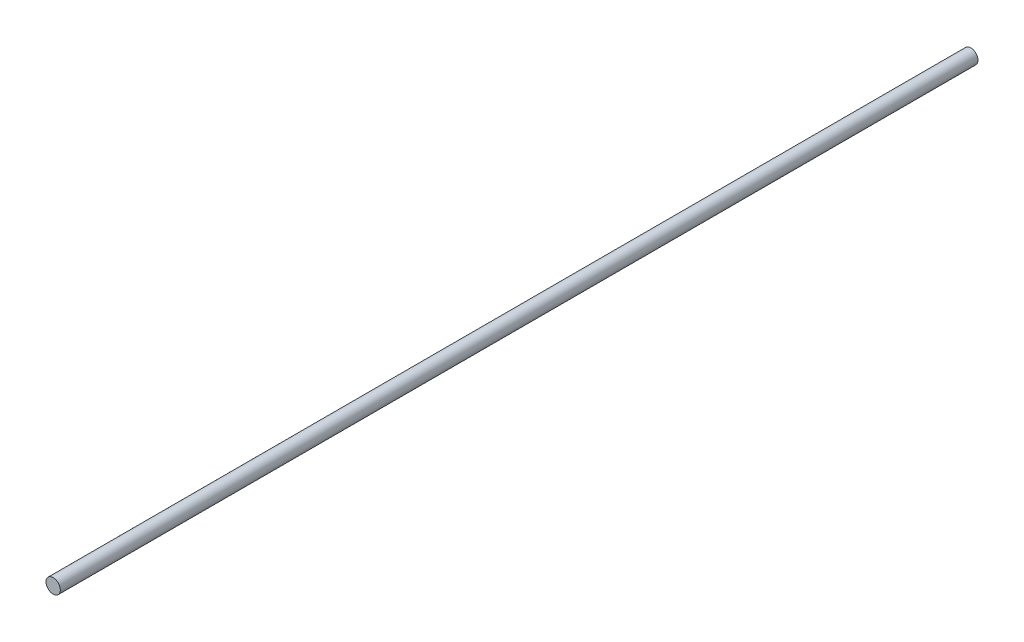
ISO-10303-21;
HEADER;
FILE_DESCRIPTION(('STEP AP214'),'2;1');
FILE_NAME('part.step','',(''),(''),'','','');
FILE_SCHEMA(('AUTOMOTIVE_DESIGN { 1 0 10303 214 1 1 1 1 }'));
ENDSEC;
DATA;
#1=APPLICATION_CONTEXT('core data for automotive mechanical design processes');
#2=APPLICATION_PROTOCOL_DEFINITION('international standard','automotive_design',2000,#1);
#3=PRODUCT_CONTEXT('',#1,'mechanical');
#4=PRODUCT('Part','Part','',(#3));
#5=PRODUCT_RELATED_PRODUCT_CATEGORY('part','',(#4));
#6=PRODUCT_DEFINITION_FORMATION('','',#4);
#7=PRODUCT_DEFINITION_CONTEXT('part definition',#1,'design');
#8=PRODUCT_DEFINITION('design','',#6,#7);
#9=PRODUCT_DEFINITION_SHAPE('','',#8);
#10=(LENGTH_UNIT() NAMED_UNIT(*) SI_UNIT(.MILLI.,.METRE.));
#11=(NAMED_UNIT(*) PLANE_ANGLE_UNIT() SI_UNIT($,.RADIAN.));
#12=(NAMED_UNIT(*) SI_UNIT($,.STERADIAN.) SOLID_ANGLE_UNIT());
#13=UNCERTAINTY_MEASURE_WITH_UNIT(LENGTH_MEASURE(1.E-05),#10,'distance_accuracy_value','');
#14=(GEOMETRIC_REPRESENTATION_CONTEXT(3) GLOBAL_UNCERTAINTY_ASSIGNED_CONTEXT((#13)) GLOBAL_UNIT_ASSIGNED_CONTEXT((#10,
#11,#12)) REPRESENTATION_CONTEXT('',''));
#15=CARTESIAN_POINT('',(0.,0.,0.));
#16=DIRECTION('',(0.,0.,1.));
#17=DIRECTION('',(1.,0.,0.));
#18=AXIS2_PLACEMENT_3D('',#15,#16,#17);
#19=CARTESIAN_POINT('',(0.,0.,101.6));
#20=DIRECTION('',(0.,0.,-1.));
#21=DIRECTION('',(-1.,0.,0.));
#22=AXIS2_PLACEMENT_3D('',#19,#20,#21);
#23=CYLINDRICAL_SURFACE('',#22,1.5875);
#24=CARTESIAN_POINT('',(0.,0.,101.6));
#25=DIRECTION('',(0.,0.,1.));
#26=DIRECTION('',(1.,0.,0.));
#27=AXIS2_PLACEMENT_3D('',#24,#25,#26);
#28=CIRCLE('',#27,1.5875);
#29=CARTESIAN_POINT('',(1.5875,0.,101.6));
#30=VERTEX_POINT('',#29);
#31=EDGE_CURVE('E10',#30,#30,#28,.T.);
#32=ORIENTED_EDGE('',*,*,#31,.F.);
#33=EDGE_LOOP('',(#32));
#34=FACE_BOUND('',#33,.T.);
#35=CARTESIAN_POINT('',(0.,0.,-101.6));
#36=DIRECTION('',(0.,0.,1.));
#37=DIRECTION('',(1.,0.,0.));
#38=AXIS2_PLACEMENT_3D('',#35,#36,#37);
#39=CIRCLE('',#38,1.5875);
#40=CARTESIAN_POINT('',(1.5875,0.,-101.6));
#41=VERTEX_POINT('',#40);
#42=EDGE_CURVE('E36',#41,#41,#39,.T.);
#43=ORIENTED_EDGE('',*,*,#42,.T.);
#44=EDGE_LOOP('',(#43));
#45=FACE_BOUND('',#44,.T.);
#46=ADVANCED_FACE('F33',(#34,#45),#23,.T.);
#47=CARTESIAN_POINT('',(0.,0.,101.6));
#48=DIRECTION('',(0.,0.,1.));
#49=DIRECTION('',(1.,0.,0.));
#50=AXIS2_PLACEMENT_3D('',#47,#48,#49);
#51=PLANE('',#50);
#52=ORIENTED_EDGE('',*,*,#31,.T.);
#53=EDGE_LOOP('',(#52));
#54=FACE_BOUND('',#53,.T.);
#55=ADVANCED_FACE('F48',(#54),#51,.T.);
#56=CARTESIAN_POINT('',(0.,0.,-101.6));
#57=DIRECTION('',(0.,0.,1.));
#58=DIRECTION('',(1.,0.,0.));
#59=AXIS2_PLACEMENT_3D('',#56,#57,#58);
#60=PLANE('',#59);
#61=ORIENTED_EDGE('',*,*,#42,.F.);
#62=EDGE_LOOP('',(#61));
#63=FACE_BOUND('',#62,.T.);
#64=ADVANCED_FACE('F46',(#63),#60,.F.);
#65=CLOSED_SHELL('',(#46,#55,#64));
#66=MANIFOLD_SOLID_BREP('B2',#65);
#67=ADVANCED_BREP_SHAPE_REPRESENTATION('',(#18,#66),#14);
#68=SHAPE_DEFINITION_REPRESENTATION(#9,#67);
ENDSEC;
END-ISO-10303-21;
